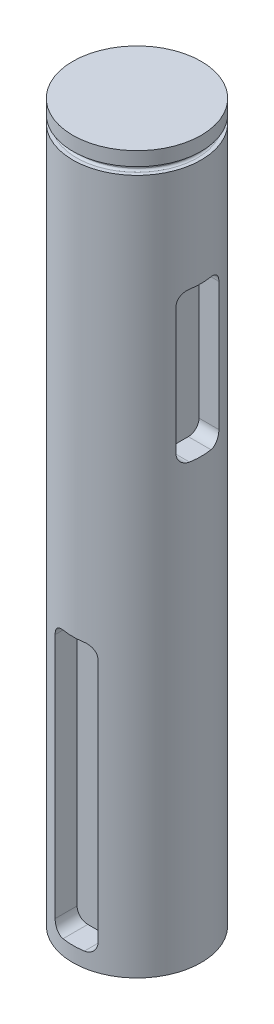
ISO-10303-21;
HEADER;
FILE_DESCRIPTION(('STEP AP214'),'2;1');
FILE_NAME('part.step','',(''),(''),'','','');
FILE_SCHEMA(('AUTOMOTIVE_DESIGN { 1 0 10303 214 1 1 1 1 }'));
ENDSEC;
DATA;
#1=APPLICATION_CONTEXT('core data for automotive mechanical design processes');
#2=APPLICATION_PROTOCOL_DEFINITION('international standard','automotive_design',2000,#1);
#3=PRODUCT_CONTEXT('',#1,'mechanical');
#4=PRODUCT('Part','Part','',(#3));
#5=PRODUCT_RELATED_PRODUCT_CATEGORY('part','',(#4));
#6=PRODUCT_DEFINITION_FORMATION('','',#4);
#7=PRODUCT_DEFINITION_CONTEXT('part definition',#1,'design');
#8=PRODUCT_DEFINITION('design','',#6,#7);
#9=PRODUCT_DEFINITION_SHAPE('','',#8);
#10=(LENGTH_UNIT() NAMED_UNIT(*) SI_UNIT(.MILLI.,.METRE.));
#11=(NAMED_UNIT(*) PLANE_ANGLE_UNIT() SI_UNIT($,.RADIAN.));
#12=(NAMED_UNIT(*) SI_UNIT($,.STERADIAN.) SOLID_ANGLE_UNIT());
#13=UNCERTAINTY_MEASURE_WITH_UNIT(LENGTH_MEASURE(1.E-05),#10,'distance_accuracy_value','');
#14=(GEOMETRIC_REPRESENTATION_CONTEXT(3) GLOBAL_UNCERTAINTY_ASSIGNED_CONTEXT((#13)) GLOBAL_UNIT_ASSIGNED_CONTEXT((#10,
#11,#12)) REPRESENTATION_CONTEXT('',''));
#15=CARTESIAN_POINT('',(0.,0.,0.));
#16=DIRECTION('',(0.,0.,1.));
#17=DIRECTION('',(1.,0.,0.));
#18=AXIS2_PLACEMENT_3D('',#15,#16,#17);
#19=CARTESIAN_POINT('',(0.,14.,0.));
#20=DIRECTION('',(0.,-1.,0.));
#21=DIRECTION('',(0.,0.,-1.));
#22=AXIS2_PLACEMENT_3D('',#19,#20,#21);
#23=CYLINDRICAL_SURFACE('',#22,6.);
#24=CARTESIAN_POINT('',(0.,26.,0.));
#25=DIRECTION('',(0.,1.,0.));
#26=DIRECTION('',(0.,0.,1.));
#27=AXIS2_PLACEMENT_3D('',#24,#25,#26);
#28=CIRCLE('',#27,6.);
#29=CARTESIAN_POINT('',(0.,26.,6.));
#30=VERTEX_POINT('',#29);
#31=EDGE_CURVE('E293',#30,#30,#28,.T.);
#32=ORIENTED_EDGE('',*,*,#31,.F.);
#33=EDGE_LOOP('',(#32));
#34=FACE_BOUND('',#33,.T.);
#35=CARTESIAN_POINT('',(0.,24.7,0.));
#36=DIRECTION('',(0.,-1.,0.));
#37=DIRECTION('',(0.,0.,-1.));
#38=AXIS2_PLACEMENT_3D('',#35,#36,#37);
#39=CIRCLE('',#38,6.);
#40=CARTESIAN_POINT('',(0.,24.7,-6.));
#41=VERTEX_POINT('',#40);
#42=EDGE_CURVE('E297',#41,#41,#39,.T.);
#43=ORIENTED_EDGE('',*,*,#42,.F.);
#44=EDGE_LOOP('',(#43));
#45=FACE_BOUND('',#44,.T.);
#46=ADVANCED_FACE('F37',(#34,#45),#23,.T.);
#47=CARTESIAN_POINT('',(0.,26.,0.));
#48=DIRECTION('',(0.,1.,0.));
#49=DIRECTION('',(0.,0.,1.));
#50=AXIS2_PLACEMENT_3D('',#47,#48,#49);
#51=PLANE('',#50);
#52=ORIENTED_EDGE('',*,*,#31,.T.);
#53=EDGE_LOOP('',(#52));
#54=FACE_BOUND('',#53,.T.);
#55=ADVANCED_FACE('F458',(#54),#51,.T.);
#56=CARTESIAN_POINT('',(-5.5030110244233,24.7,-1.28037871939337));
#57=DIRECTION('',(0.,-1.,0.));
#58=DIRECTION('',(0.,0.,-1.));
#59=AXIS2_PLACEMENT_3D('',#56,#57,#58);
#60=PLANE('',#59);
#61=CARTESIAN_POINT('',(0.,24.7,0.));
#62=DIRECTION('',(0.,-1.,0.));
#63=DIRECTION('',(0.,0.,-1.));
#64=AXIS2_PLACEMENT_3D('',#61,#62,#63);
#65=CIRCLE('',#64,5.64999999999998);
#66=CARTESIAN_POINT('',(0.,24.7,-5.64999999999998));
#67=VERTEX_POINT('',#66);
#68=EDGE_CURVE('E289',#67,#67,#65,.T.);
#69=ORIENTED_EDGE('',*,*,#68,.F.);
#70=EDGE_LOOP('',(#69));
#71=FACE_BOUND('',#70,.T.);
#72=ORIENTED_EDGE('',*,*,#42,.T.);
#73=EDGE_LOOP('',(#72));
#74=FACE_BOUND('',#73,.T.);
#75=ADVANCED_FACE('F463',(#71,#74),#60,.T.);
#76=CARTESIAN_POINT('',(-6.98833700889154,24.,-1.6259676657783));
#77=DIRECTION('',(0.,1.,0.));
#78=DIRECTION('',(0.,0.,1.));
#79=AXIS2_PLACEMENT_3D('',#76,#77,#78);
#80=PLANE('',#79);
#81=CARTESIAN_POINT('',(0.,24.,0.));
#82=DIRECTION('',(0.,-1.,0.));
#83=DIRECTION('',(0.,0.,-1.));
#84=AXIS2_PLACEMENT_3D('',#81,#82,#83);
#85=CIRCLE('',#84,5.64999999999998);
#86=CARTESIAN_POINT('',(0.,24.,-5.64999999999998));
#87=VERTEX_POINT('',#86);
#88=EDGE_CURVE('E261',#87,#87,#85,.T.);
#89=ORIENTED_EDGE('',*,*,#88,.T.);
#90=EDGE_LOOP('',(#89));
#91=FACE_BOUND('',#90,.T.);
#92=CARTESIAN_POINT('',(0.,24.,0.));
#93=DIRECTION('',(0.,1.,0.));
#94=DIRECTION('',(0.,0.,1.));
#95=AXIS2_PLACEMENT_3D('',#92,#93,#94);
#96=CIRCLE('',#95,6.);
#97=CARTESIAN_POINT('',(0.,24.,6.));
#98=VERTEX_POINT('',#97);
#99=EDGE_CURVE('E292',#98,#98,#96,.T.);
#100=ORIENTED_EDGE('',*,*,#99,.T.);
#101=EDGE_LOOP('',(#100));
#102=FACE_BOUND('',#101,.T.);
#103=ADVANCED_FACE('F341',(#91,#102),#80,.T.);
#104=CARTESIAN_POINT('',(0.,24.5,0.));
#105=DIRECTION('',(0.,-1.,0.));
#106=DIRECTION('',(0.,0.,-1.));
#107=AXIS2_PLACEMENT_3D('',#104,#105,#106);
#108=TOROIDAL_SURFACE('',#107,5.64999999999998,0.199999999999999);
#109=ORIENTED_EDGE('',*,*,#68,.T.);
#110=EDGE_LOOP('',(#109));
#111=FACE_BOUND('',#110,.T.);
#112=CARTESIAN_POINT('',(0.,24.5,0.));
#113=DIRECTION('',(0.,-1.,0.));
#114=DIRECTION('',(0.,0.,-1.));
#115=AXIS2_PLACEMENT_3D('',#112,#113,#114);
#116=CIRCLE('',#115,5.44999999999998);
#117=CARTESIAN_POINT('',(0.,24.5,-5.44999999999998));
#118=VERTEX_POINT('',#117);
#119=EDGE_CURVE('E286',#118,#118,#116,.T.);
#120=ORIENTED_EDGE('',*,*,#119,.F.);
#121=EDGE_LOOP('',(#120));
#122=FACE_BOUND('',#121,.T.);
#123=ADVANCED_FACE('F477',(#111,#122),#108,.F.);
#124=CARTESIAN_POINT('',(0.,60.2246155762171,0.));
#125=DIRECTION('',(0.,-1.,0.));
#126=DIRECTION('',(0.,0.,-1.));
#127=AXIS2_PLACEMENT_3D('',#124,#125,#126);
#128=CYLINDRICAL_SURFACE('',#127,5.44999999999998);
#129=ORIENTED_EDGE('',*,*,#119,.T.);
#130=EDGE_LOOP('',(#129));
#131=FACE_BOUND('',#130,.T.);
#132=CARTESIAN_POINT('',(0.,24.2,0.));
#133=DIRECTION('',(0.,-1.,0.));
#134=DIRECTION('',(0.,0.,-1.));
#135=AXIS2_PLACEMENT_3D('',#132,#133,#134);
#136=CIRCLE('',#135,5.44999999999998);
#137=CARTESIAN_POINT('',(0.,24.2,-5.44999999999998));
#138=VERTEX_POINT('',#137);
#139=EDGE_CURVE('E283',#138,#138,#136,.T.);
#140=ORIENTED_EDGE('',*,*,#139,.F.);
#141=EDGE_LOOP('',(#140));
#142=FACE_BOUND('',#141,.T.);
#143=ADVANCED_FACE('F472',(#131,#142),#128,.T.);
#144=CARTESIAN_POINT('',(0.,24.2,0.));
#145=DIRECTION('',(0.,-1.,0.));
#146=DIRECTION('',(0.,0.,-1.));
#147=AXIS2_PLACEMENT_3D('',#144,#145,#146);
#148=TOROIDAL_SURFACE('',#147,5.64999999999998,0.199999999999998);
#149=ORIENTED_EDGE('',*,*,#139,.T.);
#150=EDGE_LOOP('',(#149));
#151=FACE_BOUND('',#150,.T.);
#152=ORIENTED_EDGE('',*,*,#88,.F.);
#153=EDGE_LOOP('',(#152));
#154=FACE_BOUND('',#153,.T.);
#155=ADVANCED_FACE('F468',(#151,#154),#148,.F.);
#156=CARTESIAN_POINT('',(0.,-14.6,0.));
#157=DIRECTION('',(0.,1.,0.));
#158=DIRECTION('',(0.,0.,1.));
#159=AXIS2_PLACEMENT_3D('',#156,#157,#158);
#160=CIRCLE('',#159,6.);
#161=CARTESIAN_POINT('',(-1.,-14.6,5.91607978309962));
#162=VERTEX_POINT('',#161);
#163=CARTESIAN_POINT('',(0.999999999999985,-14.6,5.91607978309962));
#164=VERTEX_POINT('',#163);
#165=EDGE_CURVE('E360',#162,#164,#160,.T.);
#166=ORIENTED_EDGE('',*,*,#165,.T.);
#167=CARTESIAN_POINT('',(0.999999999999985,-14.6,5.91607978309962));
#168=CARTESIAN_POINT('',(1.05744405022135,-14.5999594240695,5.90640201240202));
#169=CARTESIAN_POINT('',(1.11469490219436,-14.6049459748043,5.89583336415347));
#170=CARTESIAN_POINT('',(1.22719911952358,-14.6244935578794,5.87342883441462));
#171=CARTESIAN_POINT('',(1.2824552750321,-14.6390406225469,5.86159482267549));
#172=CARTESIAN_POINT('',(1.38952451543959,-14.6772281974873,5.83714545083268));
#173=CARTESIAN_POINT('',(1.44133829724498,-14.7008668605524,5.82453024988558));
#174=CARTESIAN_POINT('',(1.54020609997988,-14.7565572885014,5.79916937690871));
#175=CARTESIAN_POINT('',(1.58725908697601,-14.7886108754999,5.78642367719668));
#176=CARTESIAN_POINT('',(1.67597570419012,-14.8608284154372,5.76135962724091));
#177=CARTESIAN_POINT('',(1.71755407861728,-14.9011002567264,5.74904982620252));
#178=CARTESIAN_POINT('',(1.79332249125907,-14.9884601260659,5.72586828747516));
#179=CARTESIAN_POINT('',(1.82751195679761,-15.0355486819726,5.71499666127698));
#180=CARTESIAN_POINT('',(1.88684681266634,-15.134414912555,5.69567987862656));
#181=CARTESIAN_POINT('',(1.9121399011503,-15.1860961896551,5.68719561514925));
#182=CARTESIAN_POINT('',(1.95355076042549,-15.2933495940952,5.67310524768226));
#183=CARTESIAN_POINT('',(1.96968053077614,-15.3489165254324,5.66749538055872));
#184=CARTESIAN_POINT('',(1.98724803334923,-15.4374953476407,5.6613503883933));
#185=CARTESIAN_POINT('',(1.99202469666342,-15.4698020565532,5.65966926284069));
#186=CARTESIAN_POINT('',(1.99840074381591,-15.5347329452922,5.65741979831632));
#187=CARTESIAN_POINT('',(2.00000328658689,-15.5673567769772,5.65685035299174));
#188=CARTESIAN_POINT('',(1.99999999999999,-15.6,5.65685424949238));
#189=B_SPLINE_CURVE_WITH_KNOTS('',3,(#167,#168,#169,#170,#171,#172,#173,#174,#175,#176,#177,
#178,#179,#180,#181,#182,#183,#184,#185,#186,#187,#188),.UNSPECIFIED.,.F.,.F.,(4,2,2,2,2,2,2,2,
2,2,4),(0.,0.174480157541033,0.348705968894631,0.5228964001769,0.697124580713413,
0.8738070762465,1.05050326061842,1.22410957268253,1.39748801643219,1.49543358137948,
1.59328162034533),.UNSPECIFIED.);
#190=CARTESIAN_POINT('',(1.99999999999999,-15.6,5.65685424949238));
#191=VERTEX_POINT('',#190);
#192=EDGE_CURVE('E11',#164,#191,#189,.T.);
#193=ORIENTED_EDGE('',*,*,#192,.T.);
#194=DIRECTION('',(0.,-1.,0.));
#195=VECTOR('',#194,1.);
#196=CARTESIAN_POINT('',(1.99999999999999,14.,5.65685424949238));
#197=LINE('',#196,#195);
#198=CARTESIAN_POINT('',(2.,-38.6,5.65685424949238));
#199=VERTEX_POINT('',#198);
#200=EDGE_CURVE('E50',#191,#199,#197,.T.);
#201=ORIENTED_EDGE('',*,*,#200,.T.);
#202=CARTESIAN_POINT('',(2.,-38.6,5.65685424949238));
#203=CARTESIAN_POINT('',(2.00000068443078,-38.6271406195603,5.65685281758847));
#204=CARTESIAN_POINT('',(1.99889434448995,-38.6542675920684,5.65724528085204));
#205=CARTESIAN_POINT('',(1.99448646917785,-38.7083144843185,5.6588012761065));
#206=CARTESIAN_POINT('',(1.99118541206102,-38.7352344478778,5.65996464010897));
#207=CARTESIAN_POINT('',(1.97804922022411,-38.8152401355786,5.66457521184169));
#208=CARTESIAN_POINT('',(1.96498074668406,-38.8677689800046,5.66914314724228));
#209=CARTESIAN_POINT('',(1.93069959561031,-38.9697230095197,5.68090860038521));
#210=CARTESIAN_POINT('',(1.9094895461135,-39.0191491901403,5.68810526955666));
#211=CARTESIAN_POINT('',(1.85961919606176,-39.1137250019919,5.70460377121356));
#212=CARTESIAN_POINT('',(1.83095553660669,-39.1588726926134,5.71390655255377));
#213=CARTESIAN_POINT('',(1.76602975759628,-39.2451375632919,5.73431154730347));
#214=CARTESIAN_POINT('',(1.72956083672167,-39.2860878211444,5.74546034987069));
#215=CARTESIAN_POINT('',(1.65058296050603,-39.3613938194103,5.76864525641675));
#216=CARTESIAN_POINT('',(1.60807195773591,-39.3957473151193,5.78068166050162));
#217=CARTESIAN_POINT('',(1.51600134393853,-39.4584792321005,5.80552437460228));
#218=CARTESIAN_POINT('',(1.46620754299579,-39.4865103779642,5.81834064122394));
#219=CARTESIAN_POINT('',(1.36249366414904,-39.5337243082299,5.84349667083966));
#220=CARTESIAN_POINT('',(1.30857584784196,-39.5529119024149,5.85583668949863));
#221=CARTESIAN_POINT('',(1.21215171656683,-39.5781638653744,5.87643252247859));
#222=CARTESIAN_POINT('',(1.17023429589879,-39.5863254878199,5.88492838409539));
#223=CARTESIAN_POINT('',(1.08558012495498,-39.597246789207,5.90113547403364));
#224=CARTESIAN_POINT('',(1.04284386785743,-39.6000096225441,5.9088471580345));
#225=CARTESIAN_POINT('',(0.999999999999987,-39.6,5.91607978309962));
#226=B_SPLINE_CURVE_WITH_KNOTS('',3,(#202,#203,#204,#205,#206,#207,#208,#209,#210,#211,#212,
#213,#214,#215,#216,#217,#218,#219,#220,#221,#222,#223,#224,#225),.UNSPECIFIED.,.F.,.F.,(4,2,2,
2,2,2,2,2,2,2,2,4),(0.,0.0813697321983535,0.162721738793663,0.324841613171443,0.486909200471369,
0.64904994897574,0.816183527372723,0.983373876538294,1.15825003972454,1.33303097964982,
1.46332089535387,1.59353466269523),.UNSPECIFIED.);
#227=CARTESIAN_POINT('',(0.999999999999988,-39.6,5.91607978309962));
#228=VERTEX_POINT('',#227);
#229=EDGE_CURVE('E393',#199,#228,#226,.T.);
#230=ORIENTED_EDGE('',*,*,#229,.T.);
#231=CARTESIAN_POINT('',(0.,-39.6,0.));
#232=DIRECTION('',(0.,-1.,0.));
#233=DIRECTION('',(0.,0.,-1.));
#234=AXIS2_PLACEMENT_3D('',#231,#232,#233);
#235=CIRCLE('',#234,6.);
#236=CARTESIAN_POINT('',(-0.999999999999998,-39.6,5.91607978309962));
#237=VERTEX_POINT('',#236);
#238=EDGE_CURVE('E400',#228,#237,#235,.T.);
#239=ORIENTED_EDGE('',*,*,#238,.T.);
#240=CARTESIAN_POINT('',(-0.999999999999999,-39.6,5.91607978309962));
#241=CARTESIAN_POINT('',(-1.05744405022136,-39.6000405759305,5.90640201240201));
#242=CARTESIAN_POINT('',(-1.11469490219437,-39.5950540251957,5.89583336415347));
#243=CARTESIAN_POINT('',(-1.22719911952359,-39.5755064421206,5.87342883441462));
#244=CARTESIAN_POINT('',(-1.28245527503211,-39.5609593774531,5.86159482267549));
#245=CARTESIAN_POINT('',(-1.3895245154396,-39.5227718025127,5.83714545083267));
#246=CARTESIAN_POINT('',(-1.44133829724499,-39.4991331394476,5.82453024988557));
#247=CARTESIAN_POINT('',(-1.54020609997989,-39.4434427114986,5.7991693769087));
#248=CARTESIAN_POINT('',(-1.58725908697602,-39.4113891245001,5.78642367719668));
#249=CARTESIAN_POINT('',(-1.67597570419014,-39.3391715845628,5.76135962724091));
#250=CARTESIAN_POINT('',(-1.71755407861729,-39.2988997432736,5.74904982620252));
#251=CARTESIAN_POINT('',(-1.79332249125908,-39.2115398739341,5.72586828747515));
#252=CARTESIAN_POINT('',(-1.82751195679763,-39.1644513180274,5.71499666127697));
#253=CARTESIAN_POINT('',(-1.88684681266635,-39.065585087445,5.69567987862656));
#254=CARTESIAN_POINT('',(-1.91213990115031,-39.0139038103449,5.68719561514925));
#255=CARTESIAN_POINT('',(-1.9535507604255,-38.9066504059048,5.67310524768225));
#256=CARTESIAN_POINT('',(-1.96968053077615,-38.8510834745676,5.66749538055871));
#257=CARTESIAN_POINT('',(-1.98724803334925,-38.7625046523593,5.6613503883933));
#258=CARTESIAN_POINT('',(-1.99202469666343,-38.7301979434467,5.65966926284069));
#259=CARTESIAN_POINT('',(-1.99840074381592,-38.6652670547078,5.65741979831631));
#260=CARTESIAN_POINT('',(-2.0000032865869,-38.6326432230228,5.65685035299174));
#261=CARTESIAN_POINT('',(-2.00000000000001,-38.6,5.65685424949238));
#262=B_SPLINE_CURVE_WITH_KNOTS('',3,(#240,#241,#242,#243,#244,#245,#246,#247,#248,#249,#250,
#251,#252,#253,#254,#255,#256,#257,#258,#259,#260,#261),.UNSPECIFIED.,.F.,.F.,(4,2,2,2,2,2,2,2,
2,2,4),(0.,0.174480157541033,0.34870596889463,0.522896400176895,0.697124580713413,
0.873807076246498,1.05050326061842,1.22410957268253,1.39748801643219,1.49543358137948,
1.59328162034533),.UNSPECIFIED.);
#263=CARTESIAN_POINT('',(-2.00000000000001,-38.6,5.65685424949238));
#264=VERTEX_POINT('',#263);
#265=EDGE_CURVE('E417',#237,#264,#262,.T.);
#266=ORIENTED_EDGE('',*,*,#265,.T.);
#267=DIRECTION('',(0.,-1.,0.));
#268=VECTOR('',#267,1.);
#269=CARTESIAN_POINT('',(-2.00000000000001,14.,5.65685424949238));
#270=LINE('',#269,#268);
#271=CARTESIAN_POINT('',(-2.00000000000001,-15.6,5.65685424949238));
#272=VERTEX_POINT('',#271);
#273=EDGE_CURVE('E418',#264,#272,#270,.F.);
#274=ORIENTED_EDGE('',*,*,#273,.T.);
#275=CARTESIAN_POINT('',(-2.00000000000001,-15.6,5.65685424949238));
#276=CARTESIAN_POINT('',(-2.0000006844308,-15.5728593804397,5.65685281758846));
#277=CARTESIAN_POINT('',(-1.99889434448996,-15.5457324079316,5.65724528085203));
#278=CARTESIAN_POINT('',(-1.99448646917786,-15.4916855156814,5.6588012761065));
#279=CARTESIAN_POINT('',(-1.99118541206103,-15.4647655521222,5.65996464010897));
#280=CARTESIAN_POINT('',(-1.97804922022412,-15.3847598644214,5.66457521184168));
#281=CARTESIAN_POINT('',(-1.96498074668408,-15.3322310199953,5.66914314724227));
#282=CARTESIAN_POINT('',(-1.93069959561033,-15.2302769904803,5.68090860038521));
#283=CARTESIAN_POINT('',(-1.90948954611351,-15.1808508098597,5.68810526955666));
#284=CARTESIAN_POINT('',(-1.85961919606178,-15.0862749980081,5.70460377121355));
#285=CARTESIAN_POINT('',(-1.83095553660671,-15.0411273073865,5.71390655255376));
#286=CARTESIAN_POINT('',(-1.7660297575963,-14.9548624367081,5.73431154730346));
#287=CARTESIAN_POINT('',(-1.72956083672168,-14.9139121788556,5.74546034987069));
#288=CARTESIAN_POINT('',(-1.65058296050604,-14.8386061805897,5.76864525641675));
#289=CARTESIAN_POINT('',(-1.60807195773593,-14.8042526848807,5.78068166050162));
#290=CARTESIAN_POINT('',(-1.51600134393855,-14.7415207678995,5.80552437460227));
#291=CARTESIAN_POINT('',(-1.46620754299581,-14.7134896220358,5.81834064122393));
#292=CARTESIAN_POINT('',(-1.36249366414906,-14.6662756917701,5.84349667083966));
#293=CARTESIAN_POINT('',(-1.30857584784198,-14.6470880975851,5.85583668949862));
#294=CARTESIAN_POINT('',(-1.21215171656684,-14.6218361346256,5.87643252247859));
#295=CARTESIAN_POINT('',(-1.1702342958988,-14.6136745121801,5.88492838409539));
#296=CARTESIAN_POINT('',(-1.08558012495499,-14.602753210793,5.90113547403364));
#297=CARTESIAN_POINT('',(-1.04284386785745,-14.5999903774559,5.9088471580345));
#298=CARTESIAN_POINT('',(-1.,-14.6,5.91607978309962));
#299=B_SPLINE_CURVE_WITH_KNOTS('',3,(#275,#276,#277,#278,#279,#280,#281,#282,#283,#284,#285,
#286,#287,#288,#289,#290,#291,#292,#293,#294,#295,#296,#297,#298),.UNSPECIFIED.,.F.,.F.,(4,2,2,
2,2,2,2,2,2,2,2,4),(0.,0.0813697321983587,0.16272173879367,0.32484161317144,0.486909200471364,
0.649049948975736,0.816183527372725,0.98337387653829,1.15825003972453,1.33303097964982,
1.46332089535386,1.59353466269523),.UNSPECIFIED.);
#300=EDGE_CURVE('E420',#272,#162,#299,.T.);
#301=ORIENTED_EDGE('',*,*,#300,.T.);
#302=EDGE_LOOP('',(#166,#193,#201,#230,#239,#266,#274,#301));
#303=FACE_BOUND('',#302,.T.);
#304=CARTESIAN_POINT('',(5.65685424949238,13.,2.));
#305=CARTESIAN_POINT('',(5.65685281758847,13.0271406195603,2.00000068443079));
#306=CARTESIAN_POINT('',(5.65724528085204,13.0542675920684,1.99889434448995));
#307=CARTESIAN_POINT('',(5.6588012761065,13.1083144843186,1.99448646917785));
#308=CARTESIAN_POINT('',(5.65996464010897,13.1352344478778,1.99118541206102));
#309=CARTESIAN_POINT('',(5.66457521184169,13.2152401355786,1.97804922022411));
#310=CARTESIAN_POINT('',(5.66914314724227,13.2677689800047,1.96498074668407));
#311=CARTESIAN_POINT('',(5.68090860038521,13.3697230095197,1.93069959561032));
#312=CARTESIAN_POINT('',(5.68810526955666,13.4191491901403,1.9094895461135));
#313=CARTESIAN_POINT('',(5.70460377121356,13.5137250019919,1.85961919606177));
#314=CARTESIAN_POINT('',(5.71390655255376,13.5588726926135,1.8309555366067));
#315=CARTESIAN_POINT('',(5.73431154730347,13.6451375632919,1.76602975759629));
#316=CARTESIAN_POINT('',(5.74546034987069,13.6860878211444,1.72956083672167));
#317=CARTESIAN_POINT('',(5.76864525641675,13.7613938194103,1.65058296050603));
#318=CARTESIAN_POINT('',(5.78068166050162,13.7957473151193,1.60807195773592));
#319=CARTESIAN_POINT('',(5.80552437460228,13.8584792321005,1.51600134393854));
#320=CARTESIAN_POINT('',(5.81834064122393,13.8865103779642,1.4662075429958));
#321=CARTESIAN_POINT('',(5.84349667083966,13.9337243082299,1.36249366414905));
#322=CARTESIAN_POINT('',(5.85583668949863,13.9529119024149,1.30857584784197));
#323=CARTESIAN_POINT('',(5.87643252247859,13.9781638653744,1.21215171656683));
#324=CARTESIAN_POINT('',(5.88492838409539,13.9863254878199,1.17023429589879));
#325=CARTESIAN_POINT('',(5.90113547403364,13.997246789207,1.08558012495498));
#326=CARTESIAN_POINT('',(5.9088471580345,14.0000096225441,1.04284386785744));
#327=CARTESIAN_POINT('',(5.91607978309962,14.,0.999999999999991));
#328=B_SPLINE_CURVE_WITH_KNOTS('',3,(#304,#305,#306,#307,#308,#309,#310,#311,#312,#313,#314,
#315,#316,#317,#318,#319,#320,#321,#322,#323,#324,#325,#326,#327),.UNSPECIFIED.,.F.,.F.,(4,2,2,
2,2,2,2,2,2,2,2,4),(0.,0.0813697321983587,0.162721738793672,0.32484161317144,0.486909200471364,
0.649049948975738,0.816183527372726,0.98337387653829,1.15825003972454,1.33303097964982,
1.46332089535386,1.59353466269523),.UNSPECIFIED.);
#329=CARTESIAN_POINT('',(5.65685424949238,13.,2.));
#330=VERTEX_POINT('',#329);
#331=CARTESIAN_POINT('',(5.91607978309962,14.,0.999999999999991));
#332=VERTEX_POINT('',#331);
#333=EDGE_CURVE('E352',#330,#332,#328,.T.);
#334=ORIENTED_EDGE('',*,*,#333,.T.);
#335=CARTESIAN_POINT('',(0.,14.,0.));
#336=DIRECTION('',(0.,1.,0.));
#337=DIRECTION('',(0.,0.,1.));
#338=AXIS2_PLACEMENT_3D('',#335,#336,#337);
#339=CIRCLE('',#338,6.);
#340=CARTESIAN_POINT('',(5.91607978309962,14.,-0.999999999999995));
#341=VERTEX_POINT('',#340);
#342=EDGE_CURVE('E296',#332,#341,#339,.T.);
#343=ORIENTED_EDGE('',*,*,#342,.T.);
#344=CARTESIAN_POINT('',(5.91607978309962,14.,-0.999999999999995));
#345=CARTESIAN_POINT('',(5.90640201240202,14.0000405759305,-1.05744405022136));
#346=CARTESIAN_POINT('',(5.89583336415347,13.9950540251957,-1.11469490219437));
#347=CARTESIAN_POINT('',(5.87342883441462,13.9755064421206,-1.22719911952359));
#348=CARTESIAN_POINT('',(5.86159482267549,13.9609593774531,-1.28245527503211));
#349=CARTESIAN_POINT('',(5.83714545083267,13.9227718025127,-1.3895245154396));
#350=CARTESIAN_POINT('',(5.82453024988558,13.8991331394476,-1.44133829724499));
#351=CARTESIAN_POINT('',(5.79916937690871,13.8434427114986,-1.54020609997988));
#352=CARTESIAN_POINT('',(5.78642367719668,13.8113891245001,-1.58725908697602));
#353=CARTESIAN_POINT('',(5.76135962724091,13.7391715845628,-1.67597570419013));
#354=CARTESIAN_POINT('',(5.74904982620252,13.6988997432736,-1.71755407861729));
#355=CARTESIAN_POINT('',(5.72586828747516,13.6115398739341,-1.79332249125908));
#356=CARTESIAN_POINT('',(5.71499666127697,13.5644513180274,-1.82751195679762));
#357=CARTESIAN_POINT('',(5.69567987862656,13.465585087445,-1.88684681266635));
#358=CARTESIAN_POINT('',(5.68719561514925,13.4139038103449,-1.91213990115031));
#359=CARTESIAN_POINT('',(5.67310524768226,13.3066504059048,-1.95355076042549));
#360=CARTESIAN_POINT('',(5.66749538055871,13.2510834745676,-1.96968053077614));
#361=CARTESIAN_POINT('',(5.6613503883933,13.1625046523593,-1.98724803334924));
#362=CARTESIAN_POINT('',(5.65966926284069,13.1301979434468,-1.99202469666343));
#363=CARTESIAN_POINT('',(5.65741979831632,13.0652670547078,-1.99840074381591));
#364=CARTESIAN_POINT('',(5.65685035299174,13.0326432230228,-2.0000032865869));
#365=CARTESIAN_POINT('',(5.65685424949238,13.,-2.));
#366=B_SPLINE_CURVE_WITH_KNOTS('',3,(#344,#345,#346,#347,#348,#349,#350,#351,#352,#353,#354,
#355,#356,#357,#358,#359,#360,#361,#362,#363,#364,#365),.UNSPECIFIED.,.F.,.F.,(4,2,2,2,2,2,2,2,
2,2,4),(0.,0.174480157541033,0.34870596889463,0.522896400176898,0.697124580713412,
0.873807076246497,1.05050326061842,1.22410957268253,1.39748801643219,1.49543358137948,
1.59328162034533),.UNSPECIFIED.);
#367=CARTESIAN_POINT('',(5.65685424949238,13.,-2.));
#368=VERTEX_POINT('',#367);
#369=EDGE_CURVE('E307',#341,#368,#366,.T.);
#370=ORIENTED_EDGE('',*,*,#369,.T.);
#371=DIRECTION('',(0.,-1.,0.));
#372=VECTOR('',#371,1.);
#373=CARTESIAN_POINT('',(5.65685424949238,14.,-2.));
#374=LINE('',#373,#372);
#375=CARTESIAN_POINT('',(5.65685424949238,1.00000000000001,-2.));
#376=VERTEX_POINT('',#375);
#377=EDGE_CURVE('E733',#368,#376,#374,.T.);
#378=ORIENTED_EDGE('',*,*,#377,.T.);
#379=CARTESIAN_POINT('',(5.65685424949238,1.00000000000001,-2.));
#380=CARTESIAN_POINT('',(5.65685281758846,0.972859380439662,-2.00000068443079));
#381=CARTESIAN_POINT('',(5.65724528085204,0.945732407931599,-1.99889434448995));
#382=CARTESIAN_POINT('',(5.6588012761065,0.891685515681443,-1.99448646917786));
#383=CARTESIAN_POINT('',(5.65996464010897,0.864765552122218,-1.99118541206103));
#384=CARTESIAN_POINT('',(5.66457521184169,0.784759864421369,-1.97804922022412));
#385=CARTESIAN_POINT('',(5.66914314724227,0.732231019995348,-1.96498074668407));
#386=CARTESIAN_POINT('',(5.68090860038521,0.630276990480267,-1.93069959561032));
#387=CARTESIAN_POINT('',(5.68810526955666,0.580850809859671,-1.90948954611351));
#388=CARTESIAN_POINT('',(5.70460377121355,0.486274998008095,-1.85961919606177));
#389=CARTESIAN_POINT('',(5.71390655255376,0.441127307386551,-1.8309555366067));
#390=CARTESIAN_POINT('',(5.73431154730347,0.35486243670811,-1.76602975759629));
#391=CARTESIAN_POINT('',(5.74546034987069,0.313912178855592,-1.72956083672168));
#392=CARTESIAN_POINT('',(5.76864525641675,0.238606180589669,-1.65058296050604));
#393=CARTESIAN_POINT('',(5.78068166050162,0.204252684880717,-1.60807195773592));
#394=CARTESIAN_POINT('',(5.80552437460228,0.141520767899505,-1.51600134393854));
#395=CARTESIAN_POINT('',(5.81834064122393,0.113489622035831,-1.4662075429958));
#396=CARTESIAN_POINT('',(5.84349667083966,0.0662756917701232,-1.36249366414905));
#397=CARTESIAN_POINT('',(5.85583668949863,0.0470880975850982,-1.30857584784197));
#398=CARTESIAN_POINT('',(5.87643252247859,0.0218361346256207,-1.21215171656684));
#399=CARTESIAN_POINT('',(5.88492838409539,0.0136745121800794,-1.1702342958988));
#400=CARTESIAN_POINT('',(5.90113547403364,0.00275321079297573,-1.08558012495499));
#401=CARTESIAN_POINT('',(5.9088471580345,-9.62254404861712E-06,-1.04284386785744));
#402=CARTESIAN_POINT('',(5.91607978309962,0.,-0.999999999999996));
#403=B_SPLINE_CURVE_WITH_KNOTS('',3,(#379,#380,#381,#382,#383,#384,#385,#386,#387,#388,#389,
#390,#391,#392,#393,#394,#395,#396,#397,#398,#399,#400,#401,#402),.UNSPECIFIED.,.F.,.F.,(4,2,2,
2,2,2,2,2,2,2,2,4),(0.,0.0813697321983577,0.162721738793671,0.32484161317144,0.486909200471364,
0.649049948975738,0.816183527372726,0.983373876538293,1.15825003972454,1.33303097964982,
1.46332089535386,1.59353466269523),.UNSPECIFIED.);
#404=CARTESIAN_POINT('',(5.91607978309962,0.,-0.999999999999996));
#405=VERTEX_POINT('',#404);
#406=EDGE_CURVE('E344',#376,#405,#403,.T.);
#407=ORIENTED_EDGE('',*,*,#406,.T.);
#408=CARTESIAN_POINT('',(0.,0.,0.));
#409=DIRECTION('',(0.,-1.,0.));
#410=DIRECTION('',(0.,0.,-1.));
#411=AXIS2_PLACEMENT_3D('',#408,#409,#410);
#412=CIRCLE('',#411,6.);
#413=CARTESIAN_POINT('',(5.91607978309962,0.,0.999999999999989));
#414=VERTEX_POINT('',#413);
#415=EDGE_CURVE('E304',#405,#414,#412,.T.);
#416=ORIENTED_EDGE('',*,*,#415,.T.);
#417=CARTESIAN_POINT('',(5.91607978309962,0.,0.99999999999999));
#418=CARTESIAN_POINT('',(5.90640201240201,-4.05759305357382E-05,1.05744405022135));
#419=CARTESIAN_POINT('',(5.89583336415347,0.00494597480426904,1.11469490219436));
#420=CARTESIAN_POINT('',(5.87342883441462,0.0244935578794028,1.22719911952358));
#421=CARTESIAN_POINT('',(5.86159482267549,0.0390406225469024,1.28245527503211));
#422=CARTESIAN_POINT('',(5.83714545083268,0.077228197487285,1.38952451543959));
#423=CARTESIAN_POINT('',(5.82453024988558,0.100866860552415,1.44133829724499));
#424=CARTESIAN_POINT('',(5.79916937690871,0.156557288501386,1.54020609997988));
#425=CARTESIAN_POINT('',(5.78642367719668,0.188610875499884,1.58725908697602));
#426=CARTESIAN_POINT('',(5.76135962724091,0.26082841543718,1.67597570419013));
#427=CARTESIAN_POINT('',(5.74904982620252,0.301100256726368,1.71755407861728));
#428=CARTESIAN_POINT('',(5.72586828747516,0.388460126065906,1.79332249125907));
#429=CARTESIAN_POINT('',(5.71499666127698,0.43554868197257,1.82751195679762));
#430=CARTESIAN_POINT('',(5.69567987862656,0.534414912554957,1.88684681266634));
#431=CARTESIAN_POINT('',(5.68719561514925,0.586096189655145,1.91213990115031));
#432=CARTESIAN_POINT('',(5.67310524768226,0.693349594095185,1.95355076042549));
#433=CARTESIAN_POINT('',(5.66749538055871,0.748916525432396,1.96968053077614));
#434=CARTESIAN_POINT('',(5.6613503883933,0.83749534764073,1.98724803334924));
#435=CARTESIAN_POINT('',(5.65966926284069,0.869802056553253,1.99202469666342));
#436=CARTESIAN_POINT('',(5.65741979831632,0.934732945292193,1.99840074381591));
#437=CARTESIAN_POINT('',(5.65685035299174,0.967356776977183,2.0000032865869));
#438=CARTESIAN_POINT('',(5.65685424949238,1.00000000000001,2.));
#439=B_SPLINE_CURVE_WITH_KNOTS('',3,(#417,#418,#419,#420,#421,#422,#423,#424,#425,#426,#427,
#428,#429,#430,#431,#432,#433,#434,#435,#436,#437,#438),.UNSPECIFIED.,.F.,.F.,(4,2,2,2,2,2,2,2,
2,2,4),(0.,0.174480157541033,0.34870596889463,0.522896400176899,0.697124580713412,
0.8738070762465,1.05050326061842,1.22410957268253,1.39748801643219,1.49543358137948,
1.59328162034533),.UNSPECIFIED.);
#440=CARTESIAN_POINT('',(5.65685424949238,1.00000000000001,2.));
#441=VERTEX_POINT('',#440);
#442=EDGE_CURVE('E315',#414,#441,#439,.T.);
#443=ORIENTED_EDGE('',*,*,#442,.T.);
#444=DIRECTION('',(0.,-1.,0.));
#445=VECTOR('',#444,1.);
#446=CARTESIAN_POINT('',(5.65685424949238,14.,2.));
#447=LINE('',#446,#445);
#448=EDGE_CURVE('E353',#441,#330,#447,.F.);
#449=ORIENTED_EDGE('',*,*,#448,.T.);
#450=EDGE_LOOP('',(#334,#343,#370,#378,#407,#416,#443,#449));
#451=FACE_BOUND('',#450,.T.);
#452=ORIENTED_EDGE('',*,*,#99,.F.);
#453=EDGE_LOOP('',(#452));
#454=FACE_BOUND('',#453,.T.);
#455=CARTESIAN_POINT('',(0.,-26.,0.));
#456=DIRECTION('',(0.,-1.,0.));
#457=DIRECTION('',(0.,0.,-1.));
#458=AXIS2_PLACEMENT_3D('',#455,#456,#457);
#459=CIRCLE('',#458,6.);
#460=CARTESIAN_POINT('',(-2.39791576165636,-26.,-5.5));
#461=VERTEX_POINT('',#460);
#462=CARTESIAN_POINT('',(2.39791576165636,-26.,-5.5));
#463=VERTEX_POINT('',#462);
#464=EDGE_CURVE('E168',#461,#463,#459,.T.);
#465=ORIENTED_EDGE('',*,*,#464,.F.);
#466=DIRECTION('',(0.,-1.,0.));
#467=VECTOR('',#466,1.);
#468=CARTESIAN_POINT('',(-2.39791576165636,-26.,-5.5));
#469=LINE('',#468,#467);
#470=CARTESIAN_POINT('',(-2.39791576165636,-41.,-5.5));
#471=VERTEX_POINT('',#470);
#472=EDGE_CURVE('E176',#461,#471,#469,.T.);
#473=ORIENTED_EDGE('',*,*,#472,.T.);
#474=CARTESIAN_POINT('',(0.,-41.,0.));
#475=DIRECTION('',(0.,-1.,0.));
#476=DIRECTION('',(0.,0.,1.));
#477=AXIS2_PLACEMENT_3D('',#474,#475,#476);
#478=CIRCLE('',#477,6.);
#479=CARTESIAN_POINT('',(2.39791576165636,-41.,-5.5));
#480=VERTEX_POINT('',#479);
#481=EDGE_CURVE('E181',#480,#471,#478,.T.);
#482=ORIENTED_EDGE('',*,*,#481,.F.);
#483=DIRECTION('',(0.,-1.,0.));
#484=VECTOR('',#483,1.);
#485=CARTESIAN_POINT('',(2.39791576165636,-26.,-5.5));
#486=LINE('',#485,#484);
#487=EDGE_CURVE('E57',#463,#480,#486,.T.);
#488=ORIENTED_EDGE('',*,*,#487,.F.);
#489=EDGE_LOOP('',(#465,#473,#482,#488));
#490=FACE_BOUND('',#489,.T.);
#491=ADVANCED_FACE('F179',(#303,#451,#454,#490),#23,.T.);
#492=CARTESIAN_POINT('',(3.8,1.,-1.));
#493=DIRECTION('',(1.,0.,0.));
#494=DIRECTION('',(0.,0.,-1.));
#495=AXIS2_PLACEMENT_3D('',#492,#493,#494);
#496=CYLINDRICAL_SURFACE('',#495,1.);
#497=DIRECTION('',(1.,0.,0.));
#498=VECTOR('',#497,1.);
#499=CARTESIAN_POINT('',(3.8,1.00000000000001,-2.));
#500=LINE('',#499,#498);
#501=CARTESIAN_POINT('',(3.8,1.00000000000001,-2.));
#502=VERTEX_POINT('',#501);
#503=EDGE_CURVE('E257',#502,#376,#500,.T.);
#504=ORIENTED_EDGE('',*,*,#503,.F.);
#505=CARTESIAN_POINT('',(3.8,1.,-1.));
#506=DIRECTION('',(1.,0.,0.));
#507=DIRECTION('',(0.,0.,-1.));
#508=AXIS2_PLACEMENT_3D('',#505,#506,#507);
#509=CIRCLE('',#508,1.);
#510=CARTESIAN_POINT('',(3.8,0.,-0.999999999999996));
#511=VERTEX_POINT('',#510);
#512=EDGE_CURVE('E233',#511,#502,#509,.T.);
#513=ORIENTED_EDGE('',*,*,#512,.F.);
#514=DIRECTION('',(1.,0.,0.));
#515=VECTOR('',#514,1.);
#516=CARTESIAN_POINT('',(3.8,0.,-0.999999999999996));
#517=LINE('',#516,#515);
#518=EDGE_CURVE('E258',#511,#405,#517,.T.);
#519=ORIENTED_EDGE('',*,*,#518,.T.);
#520=ORIENTED_EDGE('',*,*,#406,.F.);
#521=EDGE_LOOP('',(#504,#513,#519,#520));
#522=FACE_BOUND('',#521,.T.);
#523=ADVANCED_FACE('F335',(#522),#496,.F.);
#524=CARTESIAN_POINT('',(3.8,0.,0.999999999999989));
#525=DIRECTION('',(0.,-1.,0.));
#526=DIRECTION('',(0.,0.,-1.));
#527=AXIS2_PLACEMENT_3D('',#524,#525,#526);
#528=PLANE('',#527);
#529=ORIENTED_EDGE('',*,*,#518,.F.);
#530=DIRECTION('',(0.,0.,-1.));
#531=VECTOR('',#530,1.);
#532=CARTESIAN_POINT('',(3.8,0.,0.999999999999989));
#533=LINE('',#532,#531);
#534=CARTESIAN_POINT('',(3.8,0.,0.999999999999989));
#535=VERTEX_POINT('',#534);
#536=EDGE_CURVE('E254',#535,#511,#533,.T.);
#537=ORIENTED_EDGE('',*,*,#536,.F.);
#538=DIRECTION('',(1.,0.,0.));
#539=VECTOR('',#538,1.);
#540=CARTESIAN_POINT('',(3.8,0.,0.999999999999989));
#541=LINE('',#540,#539);
#542=EDGE_CURVE('E262',#535,#414,#541,.T.);
#543=ORIENTED_EDGE('',*,*,#542,.T.);
#544=ORIENTED_EDGE('',*,*,#415,.F.);
#545=EDGE_LOOP('',(#529,#537,#543,#544));
#546=FACE_BOUND('',#545,.T.);
#547=ADVANCED_FACE('F339',(#546),#528,.F.);
#548=CARTESIAN_POINT('',(3.8,1.,0.999999999999997));
#549=DIRECTION('',(1.,0.,0.));
#550=DIRECTION('',(0.,0.,-1.));
#551=AXIS2_PLACEMENT_3D('',#548,#549,#550);
#552=CYLINDRICAL_SURFACE('',#551,1.);
#553=ORIENTED_EDGE('',*,*,#542,.F.);
#554=CARTESIAN_POINT('',(3.8,1.,0.999999999999997));
#555=DIRECTION('',(1.,0.,0.));
#556=DIRECTION('',(0.,0.,-1.));
#557=AXIS2_PLACEMENT_3D('',#554,#555,#556);
#558=CIRCLE('',#557,1.);
#559=CARTESIAN_POINT('',(3.8,1.00000000000001,2.));
#560=VERTEX_POINT('',#559);
#561=EDGE_CURVE('E251',#560,#535,#558,.T.);
#562=ORIENTED_EDGE('',*,*,#561,.F.);
#563=DIRECTION('',(1.,0.,0.));
#564=VECTOR('',#563,1.);
#565=CARTESIAN_POINT('',(3.8,1.00000000000001,2.));
#566=LINE('',#565,#564);
#567=EDGE_CURVE('E265',#560,#441,#566,.T.);
#568=ORIENTED_EDGE('',*,*,#567,.T.);
#569=ORIENTED_EDGE('',*,*,#442,.F.);
#570=EDGE_LOOP('',(#553,#562,#568,#569));
#571=FACE_BOUND('',#570,.T.);
#572=ADVANCED_FACE('F369',(#571),#552,.F.);
#573=CARTESIAN_POINT('',(3.8,13.,2.));
#574=DIRECTION('',(0.,0.,1.));
#575=DIRECTION('',(0.,-1.,0.));
#576=AXIS2_PLACEMENT_3D('',#573,#574,#575);
#577=PLANE('',#576);
#578=ORIENTED_EDGE('',*,*,#567,.F.);
#579=DIRECTION('',(0.,-1.,0.));
#580=VECTOR('',#579,1.);
#581=CARTESIAN_POINT('',(3.8,13.,2.));
#582=LINE('',#581,#580);
#583=CARTESIAN_POINT('',(3.8,13.,2.));
#584=VERTEX_POINT('',#583);
#585=EDGE_CURVE('E248',#584,#560,#582,.T.);
#586=ORIENTED_EDGE('',*,*,#585,.F.);
#587=DIRECTION('',(1.,0.,0.));
#588=VECTOR('',#587,1.);
#589=CARTESIAN_POINT('',(3.8,13.,2.));
#590=LINE('',#589,#588);
#591=EDGE_CURVE('E268',#584,#330,#590,.T.);
#592=ORIENTED_EDGE('',*,*,#591,.T.);
#593=ORIENTED_EDGE('',*,*,#448,.F.);
#594=EDGE_LOOP('',(#578,#586,#592,#593));
#595=FACE_BOUND('',#594,.T.);
#596=ADVANCED_FACE('F366',(#595),#577,.F.);
#597=CARTESIAN_POINT('',(3.8,13.,0.999999999999998));
#598=DIRECTION('',(1.,0.,0.));
#599=DIRECTION('',(0.,0.,-1.));
#600=AXIS2_PLACEMENT_3D('',#597,#598,#599);
#601=CYLINDRICAL_SURFACE('',#600,1.);
#602=ORIENTED_EDGE('',*,*,#591,.F.);
#603=CARTESIAN_POINT('',(3.8,13.,0.999999999999998));
#604=DIRECTION('',(1.,0.,0.));
#605=DIRECTION('',(0.,0.,-1.));
#606=AXIS2_PLACEMENT_3D('',#603,#604,#605);
#607=CIRCLE('',#606,1.);
#608=CARTESIAN_POINT('',(3.8,14.,0.999999999999991));
#609=VERTEX_POINT('',#608);
#610=EDGE_CURVE('E245',#609,#584,#607,.T.);
#611=ORIENTED_EDGE('',*,*,#610,.F.);
#612=DIRECTION('',(1.,0.,0.));
#613=VECTOR('',#612,1.);
#614=CARTESIAN_POINT('',(3.8,14.,0.999999999999991));
#615=LINE('',#614,#613);
#616=EDGE_CURVE('E271',#609,#332,#615,.T.);
#617=ORIENTED_EDGE('',*,*,#616,.T.);
#618=ORIENTED_EDGE('',*,*,#333,.F.);
#619=EDGE_LOOP('',(#602,#611,#617,#618));
#620=FACE_BOUND('',#619,.T.);
#621=ADVANCED_FACE('F362',(#620),#601,.F.);
#622=CARTESIAN_POINT('',(3.8,14.,0.999999999999991));
#623=DIRECTION('',(0.,1.,0.));
#624=DIRECTION('',(0.,0.,1.));
#625=AXIS2_PLACEMENT_3D('',#622,#623,#624);
#626=PLANE('',#625);
#627=ORIENTED_EDGE('',*,*,#616,.F.);
#628=DIRECTION('',(0.,0.,1.));
#629=VECTOR('',#628,1.);
#630=CARTESIAN_POINT('',(3.8,14.,0.999999999999991));
#631=LINE('',#630,#629);
#632=CARTESIAN_POINT('',(3.8,14.,-0.999999999999995));
#633=VERTEX_POINT('',#632);
#634=EDGE_CURVE('E242',#633,#609,#631,.T.);
#635=ORIENTED_EDGE('',*,*,#634,.F.);
#636=DIRECTION('',(1.,0.,0.));
#637=VECTOR('',#636,1.);
#638=CARTESIAN_POINT('',(3.8,14.,-0.999999999999995));
#639=LINE('',#638,#637);
#640=EDGE_CURVE('E274',#633,#341,#639,.T.);
#641=ORIENTED_EDGE('',*,*,#640,.T.);
#642=ORIENTED_EDGE('',*,*,#342,.F.);
#643=EDGE_LOOP('',(#627,#635,#641,#642));
#644=FACE_BOUND('',#643,.T.);
#645=ADVANCED_FACE('F328',(#644),#626,.F.);
#646=CARTESIAN_POINT('',(3.8,13.,-1.));
#647=DIRECTION('',(1.,0.,0.));
#648=DIRECTION('',(0.,0.,-1.));
#649=AXIS2_PLACEMENT_3D('',#646,#647,#648);
#650=CYLINDRICAL_SURFACE('',#649,1.);
#651=ORIENTED_EDGE('',*,*,#640,.F.);
#652=CARTESIAN_POINT('',(3.8,13.,-1.));
#653=DIRECTION('',(1.,0.,0.));
#654=DIRECTION('',(0.,0.,1.));
#655=AXIS2_PLACEMENT_3D('',#652,#653,#654);
#656=CIRCLE('',#655,1.);
#657=CARTESIAN_POINT('',(3.8,13.,-2.));
#658=VERTEX_POINT('',#657);
#659=EDGE_CURVE('E239',#658,#633,#656,.T.);
#660=ORIENTED_EDGE('',*,*,#659,.F.);
#661=DIRECTION('',(1.,0.,0.));
#662=VECTOR('',#661,1.);
#663=CARTESIAN_POINT('',(3.8,13.,-2.));
#664=LINE('',#663,#662);
#665=EDGE_CURVE('E277',#658,#368,#664,.T.);
#666=ORIENTED_EDGE('',*,*,#665,.T.);
#667=ORIENTED_EDGE('',*,*,#369,.F.);
#668=EDGE_LOOP('',(#651,#660,#666,#667));
#669=FACE_BOUND('',#668,.T.);
#670=ADVANCED_FACE('F322',(#669),#650,.F.);
#671=CARTESIAN_POINT('',(3.8,13.,-2.));
#672=DIRECTION('',(0.,0.,-1.));
#673=DIRECTION('',(0.,1.,0.));
#674=AXIS2_PLACEMENT_3D('',#671,#672,#673);
#675=PLANE('',#674);
#676=ORIENTED_EDGE('',*,*,#665,.F.);
#677=DIRECTION('',(0.,1.,0.));
#678=VECTOR('',#677,1.);
#679=CARTESIAN_POINT('',(3.8,13.,-2.));
#680=LINE('',#679,#678);
#681=EDGE_CURVE('E236',#502,#658,#680,.T.);
#682=ORIENTED_EDGE('',*,*,#681,.F.);
#683=ORIENTED_EDGE('',*,*,#503,.T.);
#684=ORIENTED_EDGE('',*,*,#377,.F.);
#685=EDGE_LOOP('',(#676,#682,#683,#684));
#686=FACE_BOUND('',#685,.T.);
#687=ADVANCED_FACE('F327',(#686),#675,.F.);
#688=CARTESIAN_POINT('',(3.8,1.,-1.));
#689=DIRECTION('',(1.,0.,0.));
#690=DIRECTION('',(0.,0.,-1.));
#691=AXIS2_PLACEMENT_3D('',#688,#689,#690);
#692=PLANE('',#691);
#693=ORIENTED_EDGE('',*,*,#512,.T.);
#694=ORIENTED_EDGE('',*,*,#681,.T.);
#695=ORIENTED_EDGE('',*,*,#659,.T.);
#696=ORIENTED_EDGE('',*,*,#634,.T.);
#697=ORIENTED_EDGE('',*,*,#610,.T.);
#698=ORIENTED_EDGE('',*,*,#585,.T.);
#699=ORIENTED_EDGE('',*,*,#561,.T.);
#700=ORIENTED_EDGE('',*,*,#536,.T.);
#701=EDGE_LOOP('',(#693,#694,#695,#696,#697,#698,#699,#700));
#702=FACE_BOUND('',#701,.T.);
#703=ADVANCED_FACE('F333',(#702),#692,.T.);
#704=CARTESIAN_POINT('',(0.,-41.,0.));
#705=DIRECTION('',(0.,1.,0.));
#706=DIRECTION('',(0.,0.,1.));
#707=AXIS2_PLACEMENT_3D('',#704,#705,#706);
#708=PLANE('',#707);
#709=ORIENTED_EDGE('',*,*,#481,.T.);
#710=DIRECTION('',(-1.,0.,0.));
#711=VECTOR('',#710,1.);
#712=CARTESIAN_POINT('',(-2.39791576165636,-41.,-5.5));
#713=LINE('',#712,#711);
#714=EDGE_CURVE('E173',#480,#471,#713,.T.);
#715=ORIENTED_EDGE('',*,*,#714,.F.);
#716=EDGE_LOOP('',(#709,#715));
#717=FACE_BOUND('',#716,.T.);
#718=ADVANCED_FACE('F380',(#717),#708,.F.);
#719=CARTESIAN_POINT('',(0.999999999999995,-38.6,3.6));
#720=DIRECTION('',(0.,0.,1.));
#721=DIRECTION('',(1.,0.,0.));
#722=AXIS2_PLACEMENT_3D('',#719,#720,#721);
#723=CYLINDRICAL_SURFACE('',#722,1.);
#724=DIRECTION('',(0.,0.,1.));
#725=VECTOR('',#724,1.);
#726=CARTESIAN_POINT('',(2.,-38.6,3.6));
#727=LINE('',#726,#725);
#728=CARTESIAN_POINT('',(2.,-38.6,3.6));
#729=VERTEX_POINT('',#728);
#730=EDGE_CURVE('E65',#729,#199,#727,.T.);
#731=ORIENTED_EDGE('',*,*,#730,.F.);
#732=CARTESIAN_POINT('',(0.999999999999995,-38.6,3.6));
#733=DIRECTION('',(0.,0.,1.));
#734=DIRECTION('',(1.,0.,0.));
#735=AXIS2_PLACEMENT_3D('',#732,#733,#734);
#736=CIRCLE('',#735,1.);
#737=CARTESIAN_POINT('',(0.999999999999988,-39.6,3.6));
#738=VERTEX_POINT('',#737);
#739=EDGE_CURVE('E183',#738,#729,#736,.T.);
#740=ORIENTED_EDGE('',*,*,#739,.F.);
#741=DIRECTION('',(0.,0.,1.));
#742=VECTOR('',#741,1.);
#743=CARTESIAN_POINT('',(0.999999999999988,-39.6,3.6));
#744=LINE('',#743,#742);
#745=EDGE_CURVE('E210',#738,#228,#744,.T.);
#746=ORIENTED_EDGE('',*,*,#745,.T.);
#747=ORIENTED_EDGE('',*,*,#229,.F.);
#748=EDGE_LOOP('',(#731,#740,#746,#747));
#749=FACE_BOUND('',#748,.T.);
#750=ADVANCED_FACE('F384',(#749),#723,.F.);
#751=CARTESIAN_POINT('',(-0.999999999999998,-39.6,3.6));
#752=DIRECTION('',(0.,-1.,0.));
#753=DIRECTION('',(0.,0.,-1.));
#754=AXIS2_PLACEMENT_3D('',#751,#752,#753);
#755=PLANE('',#754);
#756=ORIENTED_EDGE('',*,*,#745,.F.);
#757=DIRECTION('',(1.,0.,0.));
#758=VECTOR('',#757,1.);
#759=CARTESIAN_POINT('',(-0.999999999999998,-39.6,3.6));
#760=LINE('',#759,#758);
#761=CARTESIAN_POINT('',(-0.999999999999998,-39.6,3.6));
#762=VERTEX_POINT('',#761);
#763=EDGE_CURVE('E207',#762,#738,#760,.T.);
#764=ORIENTED_EDGE('',*,*,#763,.F.);
#765=DIRECTION('',(0.,0.,1.));
#766=VECTOR('',#765,1.);
#767=CARTESIAN_POINT('',(-0.999999999999998,-39.6,3.6));
#768=LINE('',#767,#766);
#769=EDGE_CURVE('E213',#762,#237,#768,.T.);
#770=ORIENTED_EDGE('',*,*,#769,.T.);
#771=ORIENTED_EDGE('',*,*,#238,.F.);
#772=EDGE_LOOP('',(#756,#764,#770,#771));
#773=FACE_BOUND('',#772,.T.);
#774=ADVANCED_FACE('F389',(#773),#755,.F.);
#775=CARTESIAN_POINT('',(-1.00000000000001,-38.6,3.6));
#776=DIRECTION('',(0.,0.,1.));
#777=DIRECTION('',(1.,0.,0.));
#778=AXIS2_PLACEMENT_3D('',#775,#776,#777);
#779=CYLINDRICAL_SURFACE('',#778,1.);
#780=ORIENTED_EDGE('',*,*,#769,.F.);
#781=CARTESIAN_POINT('',(-1.00000000000001,-38.6,3.6));
#782=DIRECTION('',(0.,0.,1.));
#783=DIRECTION('',(1.,0.,0.));
#784=AXIS2_PLACEMENT_3D('',#781,#782,#783);
#785=CIRCLE('',#784,1.);
#786=CARTESIAN_POINT('',(-2.00000000000001,-38.6,3.6));
#787=VERTEX_POINT('',#786);
#788=EDGE_CURVE('E204',#787,#762,#785,.T.);
#789=ORIENTED_EDGE('',*,*,#788,.F.);
#790=DIRECTION('',(0.,0.,1.));
#791=VECTOR('',#790,1.);
#792=CARTESIAN_POINT('',(-2.00000000000001,-38.6,3.6));
#793=LINE('',#792,#791);
#794=EDGE_CURVE('E216',#787,#264,#793,.T.);
#795=ORIENTED_EDGE('',*,*,#794,.T.);
#796=ORIENTED_EDGE('',*,*,#265,.F.);
#797=EDGE_LOOP('',(#780,#789,#795,#796));
#798=FACE_BOUND('',#797,.T.);
#799=ADVANCED_FACE('F427',(#798),#779,.F.);
#800=CARTESIAN_POINT('',(-2.00000000000001,-15.6,3.6));
#801=DIRECTION('',(-1.,0.,0.));
#802=DIRECTION('',(0.,-1.,0.));
#803=AXIS2_PLACEMENT_3D('',#800,#801,#802);
#804=PLANE('',#803);
#805=ORIENTED_EDGE('',*,*,#794,.F.);
#806=DIRECTION('',(0.,-1.,0.));
#807=VECTOR('',#806,1.);
#808=CARTESIAN_POINT('',(-2.00000000000001,-15.6,3.6));
#809=LINE('',#808,#807);
#810=CARTESIAN_POINT('',(-2.00000000000001,-15.6,3.6));
#811=VERTEX_POINT('',#810);
#812=EDGE_CURVE('E201',#811,#787,#809,.T.);
#813=ORIENTED_EDGE('',*,*,#812,.F.);
#814=DIRECTION('',(0.,0.,1.));
#815=VECTOR('',#814,1.);
#816=CARTESIAN_POINT('',(-2.00000000000001,-15.6,3.6));
#817=LINE('',#816,#815);
#818=EDGE_CURVE('E219',#811,#272,#817,.T.);
#819=ORIENTED_EDGE('',*,*,#818,.T.);
#820=ORIENTED_EDGE('',*,*,#273,.F.);
#821=EDGE_LOOP('',(#805,#813,#819,#820));
#822=FACE_BOUND('',#821,.T.);
#823=ADVANCED_FACE('F432',(#822),#804,.F.);
#824=CARTESIAN_POINT('',(-1.00000000000001,-15.6,3.6));
#825=DIRECTION('',(0.,0.,1.));
#826=DIRECTION('',(1.,0.,0.));
#827=AXIS2_PLACEMENT_3D('',#824,#825,#826);
#828=CYLINDRICAL_SURFACE('',#827,1.);
#829=ORIENTED_EDGE('',*,*,#818,.F.);
#830=CARTESIAN_POINT('',(-1.00000000000001,-15.6,3.6));
#831=DIRECTION('',(0.,0.,1.));
#832=DIRECTION('',(1.,0.,0.));
#833=AXIS2_PLACEMENT_3D('',#830,#831,#832);
#834=CIRCLE('',#833,1.);
#835=CARTESIAN_POINT('',(-1.,-14.6,3.6));
#836=VERTEX_POINT('',#835);
#837=EDGE_CURVE('E198',#836,#811,#834,.T.);
#838=ORIENTED_EDGE('',*,*,#837,.F.);
#839=DIRECTION('',(0.,0.,1.));
#840=VECTOR('',#839,1.);
#841=CARTESIAN_POINT('',(-1.,-14.6,3.6));
#842=LINE('',#841,#840);
#843=EDGE_CURVE('E222',#836,#162,#842,.T.);
#844=ORIENTED_EDGE('',*,*,#843,.T.);
#845=ORIENTED_EDGE('',*,*,#300,.F.);
#846=EDGE_LOOP('',(#829,#838,#844,#845));
#847=FACE_BOUND('',#846,.T.);
#848=ADVANCED_FACE('F437',(#847),#828,.F.);
#849=CARTESIAN_POINT('',(-1.,-14.6,3.6));
#850=DIRECTION('',(0.,1.,0.));
#851=DIRECTION('',(0.,0.,1.));
#852=AXIS2_PLACEMENT_3D('',#849,#850,#851);
#853=PLANE('',#852);
#854=ORIENTED_EDGE('',*,*,#165,.F.);
#855=ORIENTED_EDGE('',*,*,#843,.F.);
#856=DIRECTION('',(-1.,0.,0.));
#857=VECTOR('',#856,1.);
#858=CARTESIAN_POINT('',(-1.,-14.6,3.6));
#859=LINE('',#858,#857);
#860=CARTESIAN_POINT('',(0.999999999999985,-14.6,3.6));
#861=VERTEX_POINT('',#860);
#862=EDGE_CURVE('E195',#861,#836,#859,.T.);
#863=ORIENTED_EDGE('',*,*,#862,.F.);
#864=DIRECTION('',(0.,0.,1.));
#865=VECTOR('',#864,1.);
#866=CARTESIAN_POINT('',(0.999999999999985,-14.6,3.6));
#867=LINE('',#866,#865);
#868=EDGE_CURVE('E225',#861,#164,#867,.T.);
#869=ORIENTED_EDGE('',*,*,#868,.T.);
#870=EDGE_LOOP('',(#854,#855,#863,#869));
#871=FACE_BOUND('',#870,.T.);
#872=ADVANCED_FACE('F442',(#871),#853,.F.);
#873=CARTESIAN_POINT('',(0.999999999999992,-15.6,3.6));
#874=DIRECTION('',(0.,0.,1.));
#875=DIRECTION('',(1.,0.,0.));
#876=AXIS2_PLACEMENT_3D('',#873,#874,#875);
#877=CYLINDRICAL_SURFACE('',#876,1.);
#878=ORIENTED_EDGE('',*,*,#868,.F.);
#879=CARTESIAN_POINT('',(0.999999999999992,-15.6,3.6));
#880=DIRECTION('',(0.,0.,1.));
#881=DIRECTION('',(-1.,0.,0.));
#882=AXIS2_PLACEMENT_3D('',#879,#880,#881);
#883=CIRCLE('',#882,1.);
#884=CARTESIAN_POINT('',(1.99999999999999,-15.6,3.6));
#885=VERTEX_POINT('',#884);
#886=EDGE_CURVE('E192',#885,#861,#883,.T.);
#887=ORIENTED_EDGE('',*,*,#886,.F.);
#888=DIRECTION('',(0.,0.,1.));
#889=VECTOR('',#888,1.);
#890=CARTESIAN_POINT('',(1.99999999999999,-15.6,3.6));
#891=LINE('',#890,#889);
#892=EDGE_CURVE('E228',#885,#191,#891,.T.);
#893=ORIENTED_EDGE('',*,*,#892,.T.);
#894=ORIENTED_EDGE('',*,*,#192,.F.);
#895=EDGE_LOOP('',(#878,#887,#893,#894));
#896=FACE_BOUND('',#895,.T.);
#897=ADVANCED_FACE('F409',(#896),#877,.F.);
#898=CARTESIAN_POINT('',(1.99999999999999,-15.6,3.6));
#899=DIRECTION('',(1.,0.,0.));
#900=DIRECTION('',(0.,1.,0.));
#901=AXIS2_PLACEMENT_3D('',#898,#899,#900);
#902=PLANE('',#901);
#903=ORIENTED_EDGE('',*,*,#892,.F.);
#904=DIRECTION('',(0.,1.,0.));
#905=VECTOR('',#904,1.);
#906=CARTESIAN_POINT('',(1.99999999999999,-15.6,3.6));
#907=LINE('',#906,#905);
#908=EDGE_CURVE('E189',#729,#885,#907,.T.);
#909=ORIENTED_EDGE('',*,*,#908,.F.);
#910=ORIENTED_EDGE('',*,*,#730,.T.);
#911=ORIENTED_EDGE('',*,*,#200,.F.);
#912=EDGE_LOOP('',(#903,#909,#910,#911));
#913=FACE_BOUND('',#912,.T.);
#914=ADVANCED_FACE('F391',(#913),#902,.F.);
#915=CARTESIAN_POINT('',(0.999999999999995,-38.6,3.6));
#916=DIRECTION('',(0.,0.,1.));
#917=DIRECTION('',(1.,0.,0.));
#918=AXIS2_PLACEMENT_3D('',#915,#916,#917);
#919=PLANE('',#918);
#920=ORIENTED_EDGE('',*,*,#739,.T.);
#921=ORIENTED_EDGE('',*,*,#908,.T.);
#922=ORIENTED_EDGE('',*,*,#886,.T.);
#923=ORIENTED_EDGE('',*,*,#862,.T.);
#924=ORIENTED_EDGE('',*,*,#837,.T.);
#925=ORIENTED_EDGE('',*,*,#812,.T.);
#926=ORIENTED_EDGE('',*,*,#788,.T.);
#927=ORIENTED_EDGE('',*,*,#763,.T.);
#928=EDGE_LOOP('',(#920,#921,#922,#923,#924,#925,#926,#927));
#929=FACE_BOUND('',#928,.T.);
#930=ADVANCED_FACE('F412',(#929),#919,.T.);
#931=CARTESIAN_POINT('',(-2.39791576165636,-26.,-5.5));
#932=DIRECTION('',(0.,0.,1.));
#933=DIRECTION('',(1.,0.,0.));
#934=AXIS2_PLACEMENT_3D('',#931,#932,#933);
#935=PLANE('',#934);
#936=ORIENTED_EDGE('',*,*,#714,.T.);
#937=ORIENTED_EDGE('',*,*,#472,.F.);
#938=DIRECTION('',(-1.,0.,0.));
#939=VECTOR('',#938,1.);
#940=CARTESIAN_POINT('',(-2.39791576165636,-26.,-5.5));
#941=LINE('',#940,#939);
#942=EDGE_CURVE('E170',#463,#461,#941,.T.);
#943=ORIENTED_EDGE('',*,*,#942,.F.);
#944=ORIENTED_EDGE('',*,*,#487,.T.);
#945=EDGE_LOOP('',(#936,#937,#943,#944));
#946=FACE_BOUND('',#945,.T.);
#947=ADVANCED_FACE('F175',(#946),#935,.F.);
#948=CARTESIAN_POINT('',(0.,-26.,0.));
#949=DIRECTION('',(0.,-1.,0.));
#950=DIRECTION('',(0.,0.,-1.));
#951=AXIS2_PLACEMENT_3D('',#948,#949,#950);
#952=PLANE('',#951);
#953=ORIENTED_EDGE('',*,*,#464,.T.);
#954=ORIENTED_EDGE('',*,*,#942,.T.);
#955=EDGE_LOOP('',(#953,#954));
#956=FACE_BOUND('',#955,.T.);
#957=ADVANCED_FACE('F169',(#956),#952,.T.);
#958=CLOSED_SHELL('',(#46,#55,#75,#103,#123,#143,#155,#491,#523,#547,#572,#596,#621,#645,#670,
#687,#703,#718,#750,#774,#799,#823,#848,#872,#897,#914,#930,#947,#957));
#959=MANIFOLD_SOLID_BREP('B2',#958);
#960=ADVANCED_BREP_SHAPE_REPRESENTATION('',(#18,#959),#14);
#961=SHAPE_DEFINITION_REPRESENTATION(#9,#960);
ENDSEC;
END-ISO-10303-21;
